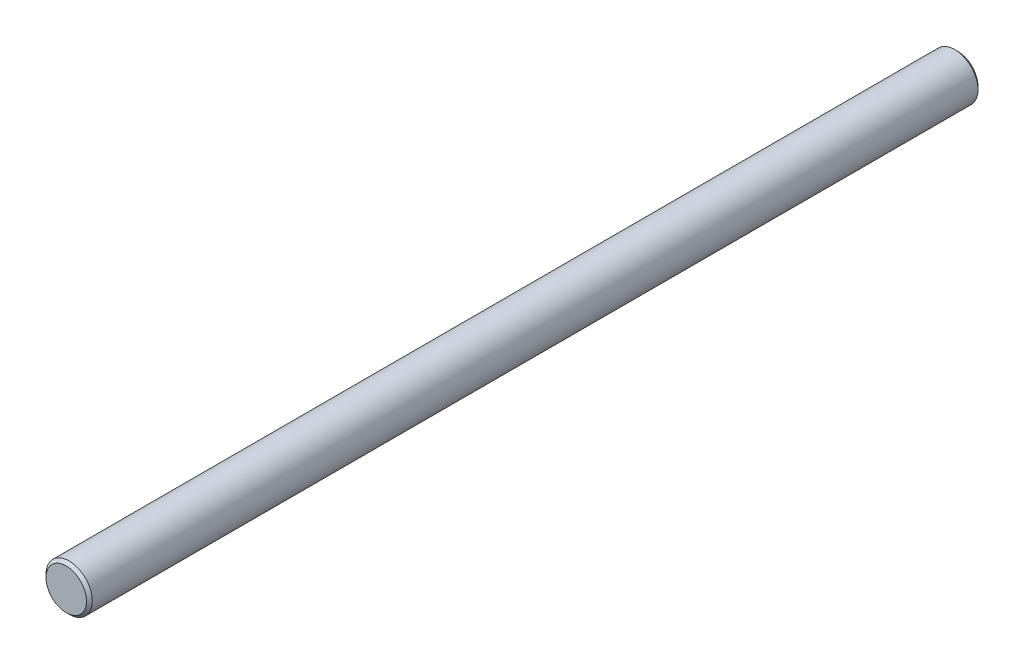
ISO-10303-21;
HEADER;
FILE_DESCRIPTION(('STEP AP214'),'2;1');
FILE_NAME('part.step','',(''),(''),'','','');
FILE_SCHEMA(('AUTOMOTIVE_DESIGN { 1 0 10303 214 1 1 1 1 }'));
ENDSEC;
DATA;
#1=APPLICATION_CONTEXT('core data for automotive mechanical design processes');
#2=APPLICATION_PROTOCOL_DEFINITION('international standard','automotive_design',2000,#1);
#3=PRODUCT_CONTEXT('',#1,'mechanical');
#4=PRODUCT('Part','Part','',(#3));
#5=PRODUCT_RELATED_PRODUCT_CATEGORY('part','',(#4));
#6=PRODUCT_DEFINITION_FORMATION('','',#4);
#7=PRODUCT_DEFINITION_CONTEXT('part definition',#1,'design');
#8=PRODUCT_DEFINITION('design','',#6,#7);
#9=PRODUCT_DEFINITION_SHAPE('','',#8);
#10=(LENGTH_UNIT() NAMED_UNIT(*) SI_UNIT(.MILLI.,.METRE.));
#11=(NAMED_UNIT(*) PLANE_ANGLE_UNIT() SI_UNIT($,.RADIAN.));
#12=(NAMED_UNIT(*) SI_UNIT($,.STERADIAN.) SOLID_ANGLE_UNIT());
#13=UNCERTAINTY_MEASURE_WITH_UNIT(LENGTH_MEASURE(1.E-05),#10,'distance_accuracy_value','');
#14=(GEOMETRIC_REPRESENTATION_CONTEXT(3) GLOBAL_UNCERTAINTY_ASSIGNED_CONTEXT((#13)) GLOBAL_UNIT_ASSIGNED_CONTEXT((#10,
#11,#12)) REPRESENTATION_CONTEXT('',''));
#15=CARTESIAN_POINT('',(0.,0.,0.));
#16=DIRECTION('',(0.,0.,1.));
#17=DIRECTION('',(1.,0.,0.));
#18=AXIS2_PLACEMENT_3D('',#15,#16,#17);
#19=CARTESIAN_POINT('',(0.,0.,77.));
#20=DIRECTION('',(0.,0.,-1.));
#21=DIRECTION('',(-1.,0.,0.));
#22=AXIS2_PLACEMENT_3D('',#19,#20,#21);
#23=CYLINDRICAL_SURFACE('',#22,4.);
#24=CARTESIAN_POINT('',(0.,0.,76.5));
#25=DIRECTION('',(0.,0.,1.));
#26=DIRECTION('',(1.,0.,0.));
#27=AXIS2_PLACEMENT_3D('',#24,#25,#26);
#28=CIRCLE('',#27,4.);
#29=CARTESIAN_POINT('',(4.,0.,76.5));
#30=VERTEX_POINT('',#29);
#31=EDGE_CURVE('E54',#30,#30,#28,.F.);
#32=ORIENTED_EDGE('',*,*,#31,.T.);
#33=EDGE_LOOP('',(#32));
#34=FACE_BOUND('',#33,.T.);
#35=CARTESIAN_POINT('',(0.,0.,-76.5));
#36=DIRECTION('',(0.,0.,1.));
#37=DIRECTION('',(1.,0.,0.));
#38=AXIS2_PLACEMENT_3D('',#35,#36,#37);
#39=CIRCLE('',#38,4.);
#40=CARTESIAN_POINT('',(4.,0.,-76.5));
#41=VERTEX_POINT('',#40);
#42=EDGE_CURVE('E59',#41,#41,#39,.T.);
#43=ORIENTED_EDGE('',*,*,#42,.T.);
#44=EDGE_LOOP('',(#43));
#45=FACE_BOUND('',#44,.T.);
#46=ADVANCED_FACE('F45',(#34,#45),#23,.T.);
#47=CARTESIAN_POINT('',(0.,0.,77.));
#48=DIRECTION('',(0.,0.,1.));
#49=DIRECTION('',(1.,0.,0.));
#50=AXIS2_PLACEMENT_3D('',#47,#48,#49);
#51=PLANE('',#50);
#52=CARTESIAN_POINT('',(0.,0.,77.));
#53=DIRECTION('',(0.,0.,1.));
#54=DIRECTION('',(1.,0.,0.));
#55=AXIS2_PLACEMENT_3D('',#52,#53,#54);
#56=CIRCLE('',#55,3.50000000000002);
#57=CARTESIAN_POINT('',(3.50000000000002,0.,77.));
#58=VERTEX_POINT('',#57);
#59=EDGE_CURVE('E64',#58,#58,#56,.T.);
#60=ORIENTED_EDGE('',*,*,#59,.T.);
#61=EDGE_LOOP('',(#60));
#62=FACE_BOUND('',#61,.T.);
#63=ADVANCED_FACE('F71',(#62),#51,.T.);
#64=CARTESIAN_POINT('',(0.,0.,-77.));
#65=DIRECTION('',(0.,0.,1.));
#66=DIRECTION('',(1.,0.,0.));
#67=AXIS2_PLACEMENT_3D('',#64,#65,#66);
#68=PLANE('',#67);
#69=CARTESIAN_POINT('',(0.,0.,-77.));
#70=DIRECTION('',(0.,0.,1.));
#71=DIRECTION('',(1.,0.,0.));
#72=AXIS2_PLACEMENT_3D('',#69,#70,#71);
#73=CIRCLE('',#72,3.49999999999999);
#74=CARTESIAN_POINT('',(3.49999999999999,0.,-77.));
#75=VERTEX_POINT('',#74);
#76=EDGE_CURVE('E10',#75,#75,#73,.F.);
#77=ORIENTED_EDGE('',*,*,#76,.T.);
#78=EDGE_LOOP('',(#77));
#79=FACE_BOUND('',#78,.T.);
#80=ADVANCED_FACE('F75',(#79),#68,.F.);
#81=CARTESIAN_POINT('',(0.,0.,77.));
#82=DIRECTION('',(0.,0.,-1.));
#83=DIRECTION('',(-1.,0.,0.));
#84=AXIS2_PLACEMENT_3D('',#81,#82,#83);
#85=CONICAL_SURFACE('',#84,3.50000000000002,0.785398163397445);
#86=ORIENTED_EDGE('',*,*,#31,.F.);
#87=EDGE_LOOP('',(#86));
#88=FACE_BOUND('',#87,.T.);
#89=ORIENTED_EDGE('',*,*,#59,.F.);
#90=EDGE_LOOP('',(#89));
#91=FACE_BOUND('',#90,.T.);
#92=ADVANCED_FACE('F73',(#88,#91),#85,.T.);
#93=CARTESIAN_POINT('',(0.,0.,-76.5));
#94=DIRECTION('',(0.,0.,1.));
#95=DIRECTION('',(1.,0.,0.));
#96=AXIS2_PLACEMENT_3D('',#93,#94,#95);
#97=CONICAL_SURFACE('',#96,4.,0.785398163397431);
#98=ORIENTED_EDGE('',*,*,#76,.F.);
#99=EDGE_LOOP('',(#98));
#100=FACE_BOUND('',#99,.T.);
#101=ORIENTED_EDGE('',*,*,#42,.F.);
#102=EDGE_LOOP('',(#101));
#103=FACE_BOUND('',#102,.T.);
#104=ADVANCED_FACE('F48',(#100,#103),#97,.T.);
#105=CLOSED_SHELL('',(#46,#63,#80,#92,#104));
#106=MANIFOLD_SOLID_BREP('B2',#105);
#107=ADVANCED_BREP_SHAPE_REPRESENTATION('',(#18,#106),#14);
#108=SHAPE_DEFINITION_REPRESENTATION(#9,#107);
ENDSEC;
END-ISO-10303-21;
